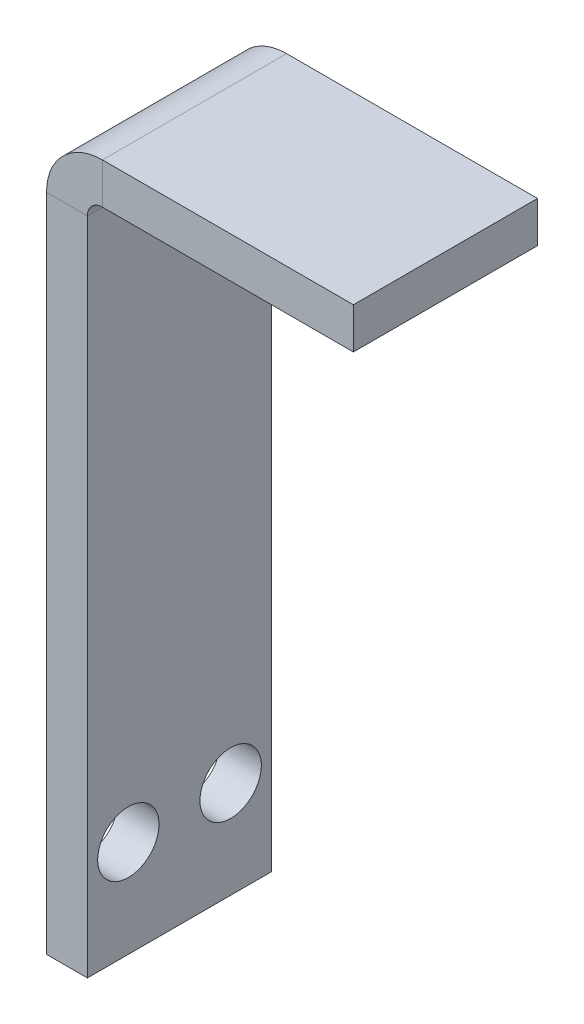
ISO-10303-21;
HEADER;
FILE_DESCRIPTION(('STEP AP214'),'2;1');
FILE_NAME('part.step','',(''),(''),'','','');
FILE_SCHEMA(('AUTOMOTIVE_DESIGN { 1 0 10303 214 1 1 1 1 }'));
ENDSEC;
DATA;
#1=APPLICATION_CONTEXT('core data for automotive mechanical design processes');
#2=APPLICATION_PROTOCOL_DEFINITION('international standard','automotive_design',2000,#1);
#3=PRODUCT_CONTEXT('',#1,'mechanical');
#4=PRODUCT('Part','Part','',(#3));
#5=PRODUCT_RELATED_PRODUCT_CATEGORY('part','',(#4));
#6=PRODUCT_DEFINITION_FORMATION('','',#4);
#7=PRODUCT_DEFINITION_CONTEXT('part definition',#1,'design');
#8=PRODUCT_DEFINITION('design','',#6,#7);
#9=PRODUCT_DEFINITION_SHAPE('','',#8);
#10=(LENGTH_UNIT() NAMED_UNIT(*) SI_UNIT(.MILLI.,.METRE.));
#11=(NAMED_UNIT(*) PLANE_ANGLE_UNIT() SI_UNIT($,.RADIAN.));
#12=(NAMED_UNIT(*) SI_UNIT($,.STERADIAN.) SOLID_ANGLE_UNIT());
#13=UNCERTAINTY_MEASURE_WITH_UNIT(LENGTH_MEASURE(1.E-05),#10,'distance_accuracy_value','');
#14=(GEOMETRIC_REPRESENTATION_CONTEXT(3) GLOBAL_UNCERTAINTY_ASSIGNED_CONTEXT((#13)) GLOBAL_UNIT_ASSIGNED_CONTEXT((#10,
#11,#12)) REPRESENTATION_CONTEXT('',''));
#15=CARTESIAN_POINT('',(0.,0.,0.));
#16=DIRECTION('',(0.,0.,1.));
#17=DIRECTION('',(1.,0.,0.));
#18=AXIS2_PLACEMENT_3D('',#15,#16,#17);
#19=CARTESIAN_POINT('',(0.,0.,4.5));
#20=DIRECTION('',(-1.,0.,0.));
#21=DIRECTION('',(0.,0.,1.));
#22=AXIS2_PLACEMENT_3D('',#19,#20,#21);
#23=PLANE('',#22);
#24=DIRECTION('',(0.,1.,0.));
#25=VECTOR('',#24,1.);
#26=CARTESIAN_POINT('',(0.,0.,-4.5));
#27=LINE('',#26,#25);
#28=CARTESIAN_POINT('',(0.,0.,-4.5));
#29=VERTEX_POINT('',#28);
#30=CARTESIAN_POINT('',(0.,32.2634,-4.5));
#31=VERTEX_POINT('',#30);
#32=EDGE_CURVE('E159',#29,#31,#27,.T.);
#33=ORIENTED_EDGE('',*,*,#32,.F.);
#34=DIRECTION('',(0.,0.,-1.));
#35=VECTOR('',#34,1.);
#36=CARTESIAN_POINT('',(0.,0.,4.5));
#37=LINE('',#36,#35);
#38=CARTESIAN_POINT('',(0.,0.,4.5));
#39=VERTEX_POINT('',#38);
#40=EDGE_CURVE('E124',#39,#29,#37,.T.);
#41=ORIENTED_EDGE('',*,*,#40,.F.);
#42=DIRECTION('',(0.,1.,0.));
#43=VECTOR('',#42,1.);
#44=CARTESIAN_POINT('',(0.,0.,4.5));
#45=LINE('',#44,#43);
#46=CARTESIAN_POINT('',(0.,32.2634,4.5));
#47=VERTEX_POINT('',#46);
#48=EDGE_CURVE('E140',#39,#47,#45,.T.);
#49=ORIENTED_EDGE('',*,*,#48,.T.);
#50=DIRECTION('',(0.,0.,-1.));
#51=VECTOR('',#50,1.);
#52=CARTESIAN_POINT('',(0.,32.2634,4.5));
#53=LINE('',#52,#51);
#54=EDGE_CURVE('E170',#47,#31,#53,.T.);
#55=ORIENTED_EDGE('',*,*,#54,.T.);
#56=EDGE_LOOP('',(#33,#41,#49,#55));
#57=FACE_BOUND('',#56,.T.);
#58=CARTESIAN_POINT('',(0.,4.75181821963583,2.5));
#59=DIRECTION('',(-1.,0.,0.));
#60=DIRECTION('',(0.,0.,1.));
#61=AXIS2_PLACEMENT_3D('',#58,#59,#60);
#62=CIRCLE('',#61,1.5);
#63=CARTESIAN_POINT('',(0.,4.75181821963583,4.));
#64=VERTEX_POINT('',#63);
#65=EDGE_CURVE('E189',#64,#64,#62,.T.);
#66=ORIENTED_EDGE('',*,*,#65,.F.);
#67=EDGE_LOOP('',(#66));
#68=FACE_BOUND('',#67,.T.);
#69=CARTESIAN_POINT('',(0.,4.75181821963583,-2.5));
#70=DIRECTION('',(-1.,0.,0.));
#71=DIRECTION('',(0.,0.,1.));
#72=AXIS2_PLACEMENT_3D('',#69,#70,#71);
#73=CIRCLE('',#72,1.5);
#74=CARTESIAN_POINT('',(0.,4.75181821963583,-0.999999999999999));
#75=VERTEX_POINT('',#74);
#76=EDGE_CURVE('E184',#75,#75,#73,.F.);
#77=ORIENTED_EDGE('',*,*,#76,.T.);
#78=EDGE_LOOP('',(#77));
#79=FACE_BOUND('',#78,.T.);
#80=ADVANCED_FACE('F41',(#57,#68,#79),#23,.T.);
#81=CARTESIAN_POINT('',(2.,0.,4.5));
#82=DIRECTION('',(-1.,0.,0.));
#83=DIRECTION('',(0.,0.,1.));
#84=AXIS2_PLACEMENT_3D('',#81,#82,#83);
#85=PLANE('',#84);
#86=CARTESIAN_POINT('',(2.,4.75181821963583,2.5));
#87=DIRECTION('',(-1.,0.,0.));
#88=DIRECTION('',(0.,0.,1.));
#89=AXIS2_PLACEMENT_3D('',#86,#87,#88);
#90=CIRCLE('',#89,1.5);
#91=CARTESIAN_POINT('',(2.,4.75181821963583,4.));
#92=VERTEX_POINT('',#91);
#93=EDGE_CURVE('E182',#92,#92,#90,.T.);
#94=ORIENTED_EDGE('',*,*,#93,.T.);
#95=EDGE_LOOP('',(#94));
#96=FACE_BOUND('',#95,.T.);
#97=DIRECTION('',(0.,1.,0.));
#98=VECTOR('',#97,1.);
#99=CARTESIAN_POINT('',(2.,0.,-4.5));
#100=LINE('',#99,#98);
#101=CARTESIAN_POINT('',(2.,0.,-4.5));
#102=VERTEX_POINT('',#101);
#103=CARTESIAN_POINT('',(2.,32.2634,-4.5));
#104=VERTEX_POINT('',#103);
#105=EDGE_CURVE('E162',#102,#104,#100,.T.);
#106=ORIENTED_EDGE('',*,*,#105,.T.);
#107=DIRECTION('',(0.,0.,-1.));
#108=VECTOR('',#107,1.);
#109=CARTESIAN_POINT('',(2.,32.2634,4.5));
#110=LINE('',#109,#108);
#111=CARTESIAN_POINT('',(2.,32.2634,4.5));
#112=VERTEX_POINT('',#111);
#113=EDGE_CURVE('E125',#112,#104,#110,.T.);
#114=ORIENTED_EDGE('',*,*,#113,.F.);
#115=DIRECTION('',(0.,1.,0.));
#116=VECTOR('',#115,1.);
#117=CARTESIAN_POINT('',(2.,0.,4.5));
#118=LINE('',#117,#116);
#119=CARTESIAN_POINT('',(2.,0.,4.5));
#120=VERTEX_POINT('',#119);
#121=EDGE_CURVE('E129',#120,#112,#118,.T.);
#122=ORIENTED_EDGE('',*,*,#121,.F.);
#123=DIRECTION('',(0.,0.,-1.));
#124=VECTOR('',#123,1.);
#125=CARTESIAN_POINT('',(2.,0.,4.5));
#126=LINE('',#125,#124);
#127=EDGE_CURVE('E116',#120,#102,#126,.T.);
#128=ORIENTED_EDGE('',*,*,#127,.T.);
#129=EDGE_LOOP('',(#106,#114,#122,#128));
#130=FACE_BOUND('',#129,.T.);
#131=CARTESIAN_POINT('',(2.,4.75181821963583,-2.5));
#132=DIRECTION('',(-1.,0.,0.));
#133=DIRECTION('',(0.,0.,1.));
#134=AXIS2_PLACEMENT_3D('',#131,#132,#133);
#135=CIRCLE('',#134,1.5);
#136=CARTESIAN_POINT('',(2.,4.75181821963583,-0.999999999999999));
#137=VERTEX_POINT('',#136);
#138=EDGE_CURVE('E45',#137,#137,#135,.F.);
#139=ORIENTED_EDGE('',*,*,#138,.F.);
#140=EDGE_LOOP('',(#139));
#141=FACE_BOUND('',#140,.T.);
#142=ADVANCED_FACE('F130',(#96,#130,#141),#85,.F.);
#143=CARTESIAN_POINT('',(2.7366,35.,4.5));
#144=DIRECTION('',(0.,0.,1.));
#145=DIRECTION('',(1.,0.,0.));
#146=AXIS2_PLACEMENT_3D('',#143,#144,#145);
#147=PLANE('',#146);
#148=DIRECTION('',(0.,-1.,0.));
#149=VECTOR('',#148,1.);
#150=CARTESIAN_POINT('',(2.7366,35.,4.5));
#151=LINE('',#150,#149);
#152=CARTESIAN_POINT('',(2.7366,35.,4.5));
#153=VERTEX_POINT('',#152);
#154=CARTESIAN_POINT('',(2.7366,33.,4.5));
#155=VERTEX_POINT('',#154);
#156=EDGE_CURVE('E11',#153,#155,#151,.T.);
#157=ORIENTED_EDGE('',*,*,#156,.F.);
#158=CARTESIAN_POINT('',(2.7366,32.2634,4.5));
#159=DIRECTION('',(0.,0.,1.));
#160=DIRECTION('',(1.,0.,0.));
#161=AXIS2_PLACEMENT_3D('',#158,#159,#160);
#162=CIRCLE('',#161,2.7366);
#163=EDGE_CURVE('E142',#47,#153,#162,.F.);
#164=ORIENTED_EDGE('',*,*,#163,.F.);
#165=DIRECTION('',(-1.,0.,0.));
#166=VECTOR('',#165,1.);
#167=CARTESIAN_POINT('',(2.,32.2634,4.5));
#168=LINE('',#167,#166);
#169=EDGE_CURVE('E51',#112,#47,#168,.T.);
#170=ORIENTED_EDGE('',*,*,#169,.F.);
#171=CARTESIAN_POINT('',(2.7366,32.2634,4.5));
#172=DIRECTION('',(0.,0.,1.));
#173=DIRECTION('',(1.,0.,0.));
#174=AXIS2_PLACEMENT_3D('',#171,#172,#173);
#175=CIRCLE('',#174,0.7366);
#176=EDGE_CURVE('E135',#112,#155,#175,.F.);
#177=ORIENTED_EDGE('',*,*,#176,.T.);
#178=EDGE_LOOP('',(#157,#164,#170,#177));
#179=FACE_BOUND('',#178,.T.);
#180=ADVANCED_FACE('F43',(#179),#147,.T.);
#181=CARTESIAN_POINT('',(2.,32.2634,4.5));
#182=DIRECTION('',(0.,0.,1.));
#183=DIRECTION('',(1.,0.,0.));
#184=AXIS2_PLACEMENT_3D('',#181,#182,#183);
#185=PLANE('',#184);
#186=DIRECTION('',(1.,0.,0.));
#187=VECTOR('',#186,1.);
#188=CARTESIAN_POINT('',(0.,35.,4.5));
#189=LINE('',#188,#187);
#190=CARTESIAN_POINT('',(15.,35.,4.5));
#191=VERTEX_POINT('',#190);
#192=EDGE_CURVE('E200',#153,#191,#189,.T.);
#193=ORIENTED_EDGE('',*,*,#192,.F.);
#194=ORIENTED_EDGE('',*,*,#156,.T.);
#195=DIRECTION('',(1.,0.,0.));
#196=VECTOR('',#195,1.);
#197=CARTESIAN_POINT('',(0.,33.,4.5));
#198=LINE('',#197,#196);
#199=CARTESIAN_POINT('',(15.,33.,4.5));
#200=VERTEX_POINT('',#199);
#201=EDGE_CURVE('E100',#155,#200,#198,.T.);
#202=ORIENTED_EDGE('',*,*,#201,.T.);
#203=DIRECTION('',(0.,-1.,0.));
#204=VECTOR('',#203,1.);
#205=CARTESIAN_POINT('',(15.,35.,4.5));
#206=LINE('',#205,#204);
#207=EDGE_CURVE('E197',#191,#200,#206,.T.);
#208=ORIENTED_EDGE('',*,*,#207,.F.);
#209=EDGE_LOOP('',(#193,#194,#202,#208));
#210=FACE_BOUND('',#209,.T.);
#211=ADVANCED_FACE('F220',(#210),#185,.T.);
#212=CARTESIAN_POINT('',(0.,32.2634,-4.5));
#213=DIRECTION('',(0.,0.,-1.));
#214=DIRECTION('',(-1.,0.,0.));
#215=AXIS2_PLACEMENT_3D('',#212,#213,#214);
#216=PLANE('',#215);
#217=DIRECTION('',(1.,0.,0.));
#218=VECTOR('',#217,1.);
#219=CARTESIAN_POINT('',(0.,32.2634,-4.5));
#220=LINE('',#219,#218);
#221=EDGE_CURVE('E87',#31,#104,#220,.T.);
#222=ORIENTED_EDGE('',*,*,#221,.F.);
#223=CARTESIAN_POINT('',(2.7366,32.2634,-4.5));
#224=DIRECTION('',(0.,0.,1.));
#225=DIRECTION('',(1.,0.,0.));
#226=AXIS2_PLACEMENT_3D('',#223,#224,#225);
#227=CIRCLE('',#226,2.7366);
#228=CARTESIAN_POINT('',(2.7366,35.,-4.5));
#229=VERTEX_POINT('',#228);
#230=EDGE_CURVE('E157',#31,#229,#227,.F.);
#231=ORIENTED_EDGE('',*,*,#230,.T.);
#232=DIRECTION('',(0.,1.,0.));
#233=VECTOR('',#232,1.);
#234=CARTESIAN_POINT('',(2.7366,33.,-4.5));
#235=LINE('',#234,#233);
#236=CARTESIAN_POINT('',(2.7366,33.,-4.5));
#237=VERTEX_POINT('',#236);
#238=EDGE_CURVE('E94',#237,#229,#235,.T.);
#239=ORIENTED_EDGE('',*,*,#238,.F.);
#240=CARTESIAN_POINT('',(2.7366,32.2634,-4.5));
#241=DIRECTION('',(0.,0.,1.));
#242=DIRECTION('',(1.,0.,0.));
#243=AXIS2_PLACEMENT_3D('',#240,#241,#242);
#244=CIRCLE('',#243,0.7366);
#245=EDGE_CURVE('E164',#104,#237,#244,.F.);
#246=ORIENTED_EDGE('',*,*,#245,.F.);
#247=EDGE_LOOP('',(#222,#231,#239,#246));
#248=FACE_BOUND('',#247,.T.);
#249=ADVANCED_FACE('F218',(#248),#216,.T.);
#250=CARTESIAN_POINT('',(2.7366,33.,-4.5));
#251=DIRECTION('',(0.,0.,-1.));
#252=DIRECTION('',(-1.,0.,0.));
#253=AXIS2_PLACEMENT_3D('',#250,#251,#252);
#254=PLANE('',#253);
#255=ORIENTED_EDGE('',*,*,#32,.T.);
#256=ORIENTED_EDGE('',*,*,#221,.T.);
#257=ORIENTED_EDGE('',*,*,#105,.F.);
#258=DIRECTION('',(-1.,0.,0.));
#259=VECTOR('',#258,1.);
#260=CARTESIAN_POINT('',(2.,0.,-4.5));
#261=LINE('',#260,#259);
#262=EDGE_CURVE('E122',#102,#29,#261,.T.);
#263=ORIENTED_EDGE('',*,*,#262,.T.);
#264=EDGE_LOOP('',(#255,#256,#257,#263));
#265=FACE_BOUND('',#264,.T.);
#266=ADVANCED_FACE('F214',(#265),#254,.T.);
#267=CARTESIAN_POINT('',(0.,33.,4.5));
#268=DIRECTION('',(0.,1.,0.));
#269=DIRECTION('',(0.,0.,1.));
#270=AXIS2_PLACEMENT_3D('',#267,#268,#269);
#271=PLANE('',#270);
#272=DIRECTION('',(1.,0.,0.));
#273=VECTOR('',#272,1.);
#274=CARTESIAN_POINT('',(0.,33.,-4.5));
#275=LINE('',#274,#273);
#276=CARTESIAN_POINT('',(15.,33.,-4.5));
#277=VERTEX_POINT('',#276);
#278=EDGE_CURVE('E148',#237,#277,#275,.T.);
#279=ORIENTED_EDGE('',*,*,#278,.T.);
#280=DIRECTION('',(0.,0.,-1.));
#281=VECTOR('',#280,1.);
#282=CARTESIAN_POINT('',(15.,33.,4.5));
#283=LINE('',#282,#281);
#284=EDGE_CURVE('E178',#200,#277,#283,.T.);
#285=ORIENTED_EDGE('',*,*,#284,.F.);
#286=ORIENTED_EDGE('',*,*,#201,.F.);
#287=DIRECTION('',(0.,0.,-1.));
#288=VECTOR('',#287,1.);
#289=CARTESIAN_POINT('',(2.7366,33.,4.5));
#290=LINE('',#289,#288);
#291=EDGE_CURVE('E147',#155,#237,#290,.T.);
#292=ORIENTED_EDGE('',*,*,#291,.T.);
#293=EDGE_LOOP('',(#279,#285,#286,#292));
#294=FACE_BOUND('',#293,.T.);
#295=ADVANCED_FACE('F226',(#294),#271,.F.);
#296=CARTESIAN_POINT('',(15.,35.,4.5));
#297=DIRECTION('',(1.,0.,0.));
#298=DIRECTION('',(0.,0.,-1.));
#299=AXIS2_PLACEMENT_3D('',#296,#297,#298);
#300=PLANE('',#299);
#301=DIRECTION('',(0.,-1.,0.));
#302=VECTOR('',#301,1.);
#303=CARTESIAN_POINT('',(15.,35.,-4.5));
#304=LINE('',#303,#302);
#305=CARTESIAN_POINT('',(15.,35.,-4.5));
#306=VERTEX_POINT('',#305);
#307=EDGE_CURVE('E151',#306,#277,#304,.T.);
#308=ORIENTED_EDGE('',*,*,#307,.F.);
#309=DIRECTION('',(0.,0.,-1.));
#310=VECTOR('',#309,1.);
#311=CARTESIAN_POINT('',(15.,35.,4.5));
#312=LINE('',#311,#310);
#313=EDGE_CURVE('E176',#191,#306,#312,.T.);
#314=ORIENTED_EDGE('',*,*,#313,.F.);
#315=ORIENTED_EDGE('',*,*,#207,.T.);
#316=ORIENTED_EDGE('',*,*,#284,.T.);
#317=EDGE_LOOP('',(#308,#314,#315,#316));
#318=FACE_BOUND('',#317,.T.);
#319=ADVANCED_FACE('F241',(#318),#300,.T.);
#320=CARTESIAN_POINT('',(0.,35.,4.5));
#321=DIRECTION('',(0.,1.,0.));
#322=DIRECTION('',(0.,0.,1.));
#323=AXIS2_PLACEMENT_3D('',#320,#321,#322);
#324=PLANE('',#323);
#325=DIRECTION('',(1.,0.,0.));
#326=VECTOR('',#325,1.);
#327=CARTESIAN_POINT('',(0.,35.,-4.5));
#328=LINE('',#327,#326);
#329=EDGE_CURVE('E154',#229,#306,#328,.T.);
#330=ORIENTED_EDGE('',*,*,#329,.F.);
#331=DIRECTION('',(0.,0.,-1.));
#332=VECTOR('',#331,1.);
#333=CARTESIAN_POINT('',(2.7366,35.,4.5));
#334=LINE('',#333,#332);
#335=EDGE_CURVE('E173',#153,#229,#334,.T.);
#336=ORIENTED_EDGE('',*,*,#335,.F.);
#337=ORIENTED_EDGE('',*,*,#192,.T.);
#338=ORIENTED_EDGE('',*,*,#313,.T.);
#339=EDGE_LOOP('',(#330,#336,#337,#338));
#340=FACE_BOUND('',#339,.T.);
#341=ADVANCED_FACE('F238',(#340),#324,.T.);
#342=CARTESIAN_POINT('',(2.7366,32.2634,4.5));
#343=DIRECTION('',(0.,0.,-1.));
#344=DIRECTION('',(-1.,0.,0.));
#345=AXIS2_PLACEMENT_3D('',#342,#343,#344);
#346=CYLINDRICAL_SURFACE('',#345,2.7366);
#347=ORIENTED_EDGE('',*,*,#230,.F.);
#348=ORIENTED_EDGE('',*,*,#54,.F.);
#349=ORIENTED_EDGE('',*,*,#163,.T.);
#350=ORIENTED_EDGE('',*,*,#335,.T.);
#351=EDGE_LOOP('',(#347,#348,#349,#350));
#352=FACE_BOUND('',#351,.T.);
#353=ADVANCED_FACE('F207',(#352),#346,.T.);
#354=CARTESIAN_POINT('',(2.,0.,4.5));
#355=DIRECTION('',(0.,-1.,0.));
#356=DIRECTION('',(0.,0.,-1.));
#357=AXIS2_PLACEMENT_3D('',#354,#355,#356);
#358=PLANE('',#357);
#359=ORIENTED_EDGE('',*,*,#262,.F.);
#360=ORIENTED_EDGE('',*,*,#127,.F.);
#361=DIRECTION('',(-1.,0.,0.));
#362=VECTOR('',#361,1.);
#363=CARTESIAN_POINT('',(2.,0.,4.5));
#364=LINE('',#363,#362);
#365=EDGE_CURVE('E120',#120,#39,#364,.T.);
#366=ORIENTED_EDGE('',*,*,#365,.T.);
#367=ORIENTED_EDGE('',*,*,#40,.T.);
#368=EDGE_LOOP('',(#359,#360,#366,#367));
#369=FACE_BOUND('',#368,.T.);
#370=ADVANCED_FACE('F118',(#369),#358,.T.);
#371=CARTESIAN_POINT('',(2.7366,32.2634,4.5));
#372=DIRECTION('',(0.,0.,-1.));
#373=DIRECTION('',(-1.,0.,0.));
#374=AXIS2_PLACEMENT_3D('',#371,#372,#373);
#375=CYLINDRICAL_SURFACE('',#374,0.7366);
#376=ORIENTED_EDGE('',*,*,#245,.T.);
#377=ORIENTED_EDGE('',*,*,#291,.F.);
#378=ORIENTED_EDGE('',*,*,#176,.F.);
#379=ORIENTED_EDGE('',*,*,#113,.T.);
#380=EDGE_LOOP('',(#376,#377,#378,#379));
#381=FACE_BOUND('',#380,.T.);
#382=ADVANCED_FACE('F216',(#381),#375,.F.);
#383=CARTESIAN_POINT('',(2.7366,32.2634,4.5));
#384=DIRECTION('',(0.,0.,1.));
#385=DIRECTION('',(1.,0.,0.));
#386=AXIS2_PLACEMENT_3D('',#383,#384,#385);
#387=PLANE('',#386);
#388=ORIENTED_EDGE('',*,*,#121,.T.);
#389=ORIENTED_EDGE('',*,*,#169,.T.);
#390=ORIENTED_EDGE('',*,*,#48,.F.);
#391=ORIENTED_EDGE('',*,*,#365,.F.);
#392=EDGE_LOOP('',(#388,#389,#390,#391));
#393=FACE_BOUND('',#392,.T.);
#394=ADVANCED_FACE('F138',(#393),#387,.T.);
#395=CARTESIAN_POINT('',(2.7366,32.2634,-4.5));
#396=DIRECTION('',(0.,0.,1.));
#397=DIRECTION('',(1.,0.,0.));
#398=AXIS2_PLACEMENT_3D('',#395,#396,#397);
#399=PLANE('',#398);
#400=ORIENTED_EDGE('',*,*,#278,.F.);
#401=ORIENTED_EDGE('',*,*,#238,.T.);
#402=ORIENTED_EDGE('',*,*,#329,.T.);
#403=ORIENTED_EDGE('',*,*,#307,.T.);
#404=EDGE_LOOP('',(#400,#401,#402,#403));
#405=FACE_BOUND('',#404,.T.);
#406=ADVANCED_FACE('F253',(#405),#399,.F.);
#407=CARTESIAN_POINT('',(10.,4.75181821963583,2.5));
#408=DIRECTION('',(-1.,0.,0.));
#409=DIRECTION('',(0.,0.,1.));
#410=AXIS2_PLACEMENT_3D('',#407,#408,#409);
#411=CYLINDRICAL_SURFACE('',#410,1.5);
#412=ORIENTED_EDGE('',*,*,#65,.T.);
#413=EDGE_LOOP('',(#412));
#414=FACE_BOUND('',#413,.T.);
#415=ORIENTED_EDGE('',*,*,#93,.F.);
#416=EDGE_LOOP('',(#415));
#417=FACE_BOUND('',#416,.T.);
#418=ADVANCED_FACE('F255',(#414,#417),#411,.F.);
#419=CARTESIAN_POINT('',(10.,4.75181821963583,-2.5));
#420=DIRECTION('',(-1.,0.,0.));
#421=DIRECTION('',(0.,0.,1.));
#422=AXIS2_PLACEMENT_3D('',#419,#420,#421);
#423=CYLINDRICAL_SURFACE('',#422,1.5);
#424=ORIENTED_EDGE('',*,*,#76,.F.);
#425=EDGE_LOOP('',(#424));
#426=FACE_BOUND('',#425,.T.);
#427=ORIENTED_EDGE('',*,*,#138,.T.);
#428=EDGE_LOOP('',(#427));
#429=FACE_BOUND('',#428,.T.);
#430=ADVANCED_FACE('F261',(#426,#429),#423,.F.);
#431=CLOSED_SHELL('',(#80,#142,#180,#211,#249,#266,#295,#319,#341,#353,#370,#382,#394,#406,#418,#430));
#432=MANIFOLD_SOLID_BREP('B2',#431);
#433=ADVANCED_BREP_SHAPE_REPRESENTATION('',(#18,#432),#14);
#434=SHAPE_DEFINITION_REPRESENTATION(#9,#433);
ENDSEC;
END-ISO-10303-21;
